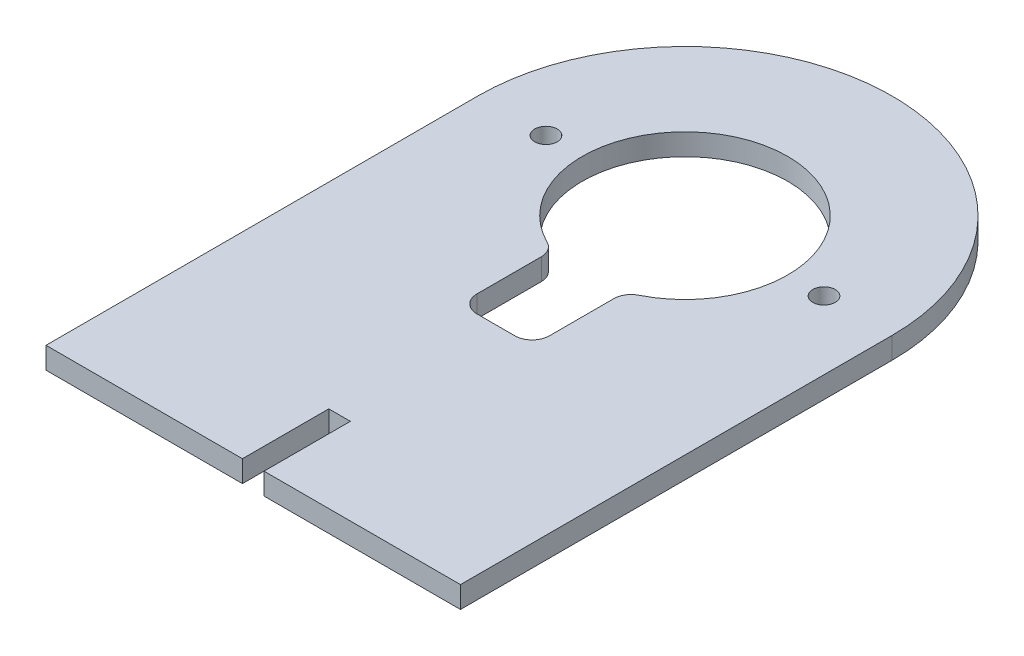
ISO-10303-21;
HEADER;
FILE_DESCRIPTION(('STEP AP214'),'2;1');
FILE_NAME('part.step','',(''),(''),'','','');
FILE_SCHEMA(('AUTOMOTIVE_DESIGN { 1 0 10303 214 1 1 1 1 }'));
ENDSEC;
DATA;
#1=APPLICATION_CONTEXT('core data for automotive mechanical design processes');
#2=APPLICATION_PROTOCOL_DEFINITION('international standard','automotive_design',2000,#1);
#3=PRODUCT_CONTEXT('',#1,'mechanical');
#4=PRODUCT('Part','Part','',(#3));
#5=PRODUCT_RELATED_PRODUCT_CATEGORY('part','',(#4));
#6=PRODUCT_DEFINITION_FORMATION('','',#4);
#7=PRODUCT_DEFINITION_CONTEXT('part definition',#1,'design');
#8=PRODUCT_DEFINITION('design','',#6,#7);
#9=PRODUCT_DEFINITION_SHAPE('','',#8);
#10=(LENGTH_UNIT() NAMED_UNIT(*) SI_UNIT(.MILLI.,.METRE.));
#11=(NAMED_UNIT(*) PLANE_ANGLE_UNIT() SI_UNIT($,.RADIAN.));
#12=(NAMED_UNIT(*) SI_UNIT($,.STERADIAN.) SOLID_ANGLE_UNIT());
#13=UNCERTAINTY_MEASURE_WITH_UNIT(LENGTH_MEASURE(1.E-05),#10,'distance_accuracy_value','');
#14=(GEOMETRIC_REPRESENTATION_CONTEXT(3) GLOBAL_UNCERTAINTY_ASSIGNED_CONTEXT((#13)) GLOBAL_UNIT_ASSIGNED_CONTEXT((#10,
#11,#12)) REPRESENTATION_CONTEXT('',''));
#15=CARTESIAN_POINT('',(0.,0.,0.));
#16=DIRECTION('',(0.,0.,1.));
#17=DIRECTION('',(1.,0.,0.));
#18=AXIS2_PLACEMENT_3D('',#15,#16,#17);
#19=CARTESIAN_POINT('',(30.48,3.175,0.));
#20=DIRECTION('',(1.,0.,0.));
#21=DIRECTION('',(0.,0.,-1.));
#22=AXIS2_PLACEMENT_3D('',#19,#20,#21);
#23=PLANE('',#22);
#24=DIRECTION('',(0.,0.,1.));
#25=VECTOR('',#24,1.);
#26=CARTESIAN_POINT('',(30.48,0.,0.));
#27=LINE('',#26,#25);
#28=CARTESIAN_POINT('',(30.48,0.,0.));
#29=VERTEX_POINT('',#28);
#30=CARTESIAN_POINT('',(30.48,0.,63.5));
#31=VERTEX_POINT('',#30);
#32=EDGE_CURVE('E156',#29,#31,#27,.T.);
#33=ORIENTED_EDGE('',*,*,#32,.F.);
#34=DIRECTION('',(0.,-1.,0.));
#35=VECTOR('',#34,1.);
#36=CARTESIAN_POINT('',(30.48,3.175,0.));
#37=LINE('',#36,#35);
#38=CARTESIAN_POINT('',(30.48,3.175,0.));
#39=VERTEX_POINT('',#38);
#40=EDGE_CURVE('E151',#39,#29,#37,.T.);
#41=ORIENTED_EDGE('',*,*,#40,.F.);
#42=DIRECTION('',(0.,0.,1.));
#43=VECTOR('',#42,1.);
#44=CARTESIAN_POINT('',(30.48,3.175,0.));
#45=LINE('',#44,#43);
#46=CARTESIAN_POINT('',(30.48,3.175,63.5));
#47=VERTEX_POINT('',#46);
#48=EDGE_CURVE('E154',#39,#47,#45,.T.);
#49=ORIENTED_EDGE('',*,*,#48,.T.);
#50=DIRECTION('',(0.,-1.,0.));
#51=VECTOR('',#50,1.);
#52=CARTESIAN_POINT('',(30.48,3.175,63.5));
#53=LINE('',#52,#51);
#54=EDGE_CURVE('E230',#47,#31,#53,.T.);
#55=ORIENTED_EDGE('',*,*,#54,.T.);
#56=EDGE_LOOP('',(#33,#41,#49,#55));
#57=FACE_BOUND('',#56,.T.);
#58=ADVANCED_FACE('F38',(#57),#23,.T.);
#59=CARTESIAN_POINT('',(0.,3.175,0.));
#60=DIRECTION('',(0.,-1.,0.));
#61=DIRECTION('',(0.,0.,-1.));
#62=AXIS2_PLACEMENT_3D('',#59,#60,#61);
#63=CYLINDRICAL_SURFACE('',#62,30.48);
#64=CARTESIAN_POINT('',(0.,0.,0.));
#65=DIRECTION('',(0.,1.,0.));
#66=DIRECTION('',(0.,0.,1.));
#67=AXIS2_PLACEMENT_3D('',#64,#65,#66);
#68=CIRCLE('',#67,30.48);
#69=CARTESIAN_POINT('',(-30.48,0.,0.));
#70=VERTEX_POINT('',#69);
#71=EDGE_CURVE('E212',#29,#70,#68,.T.);
#72=ORIENTED_EDGE('',*,*,#71,.T.);
#73=DIRECTION('',(0.,-1.,0.));
#74=VECTOR('',#73,1.);
#75=CARTESIAN_POINT('',(-30.48,3.175,0.));
#76=LINE('',#75,#74);
#77=CARTESIAN_POINT('',(-30.48,3.175,0.));
#78=VERTEX_POINT('',#77);
#79=EDGE_CURVE('E161',#78,#70,#76,.T.);
#80=ORIENTED_EDGE('',*,*,#79,.F.);
#81=CARTESIAN_POINT('',(0.,3.175,0.));
#82=DIRECTION('',(0.,1.,0.));
#83=DIRECTION('',(0.,0.,1.));
#84=AXIS2_PLACEMENT_3D('',#81,#82,#83);
#85=CIRCLE('',#84,30.48);
#86=EDGE_CURVE('E165',#39,#78,#85,.T.);
#87=ORIENTED_EDGE('',*,*,#86,.F.);
#88=ORIENTED_EDGE('',*,*,#40,.T.);
#89=EDGE_LOOP('',(#72,#80,#87,#88));
#90=FACE_BOUND('',#89,.T.);
#91=ADVANCED_FACE('F166',(#90),#63,.T.);
#92=CARTESIAN_POINT('',(-30.48,3.175,0.));
#93=DIRECTION('',(1.,0.,0.));
#94=DIRECTION('',(0.,0.,-1.));
#95=AXIS2_PLACEMENT_3D('',#92,#93,#94);
#96=PLANE('',#95);
#97=DIRECTION('',(0.,0.,1.));
#98=VECTOR('',#97,1.);
#99=CARTESIAN_POINT('',(-30.48,0.,0.));
#100=LINE('',#99,#98);
#101=CARTESIAN_POINT('',(-30.48,0.,63.5));
#102=VERTEX_POINT('',#101);
#103=EDGE_CURVE('E214',#70,#102,#100,.T.);
#104=ORIENTED_EDGE('',*,*,#103,.T.);
#105=DIRECTION('',(0.,-1.,0.));
#106=VECTOR('',#105,1.);
#107=CARTESIAN_POINT('',(-30.48,3.175,63.5));
#108=LINE('',#107,#106);
#109=CARTESIAN_POINT('',(-30.48,3.175,63.5));
#110=VERTEX_POINT('',#109);
#111=EDGE_CURVE('E242',#110,#102,#108,.T.);
#112=ORIENTED_EDGE('',*,*,#111,.F.);
#113=DIRECTION('',(0.,0.,1.));
#114=VECTOR('',#113,1.);
#115=CARTESIAN_POINT('',(-30.48,3.175,0.));
#116=LINE('',#115,#114);
#117=EDGE_CURVE('E170',#78,#110,#116,.T.);
#118=ORIENTED_EDGE('',*,*,#117,.F.);
#119=ORIENTED_EDGE('',*,*,#79,.T.);
#120=EDGE_LOOP('',(#104,#112,#118,#119));
#121=FACE_BOUND('',#120,.T.);
#122=ADVANCED_FACE('F311',(#121),#96,.F.);
#123=CARTESIAN_POINT('',(0.,3.175,63.5));
#124=DIRECTION('',(0.,0.,-1.));
#125=DIRECTION('',(-1.,0.,0.));
#126=AXIS2_PLACEMENT_3D('',#123,#124,#125);
#127=PLANE('',#126);
#128=DIRECTION('',(1.,0.,0.));
#129=VECTOR('',#128,1.);
#130=CARTESIAN_POINT('',(0.,0.,63.5));
#131=LINE('',#130,#129);
#132=CARTESIAN_POINT('',(-1.5875,0.,63.5));
#133=VERTEX_POINT('',#132);
#134=EDGE_CURVE('E217',#102,#133,#131,.T.);
#135=ORIENTED_EDGE('',*,*,#134,.T.);
#136=DIRECTION('',(0.,-1.,0.));
#137=VECTOR('',#136,1.);
#138=CARTESIAN_POINT('',(-1.5875,3.175,63.5));
#139=LINE('',#138,#137);
#140=CARTESIAN_POINT('',(-1.5875,3.175,63.5));
#141=VERTEX_POINT('',#140);
#142=EDGE_CURVE('E240',#141,#133,#139,.T.);
#143=ORIENTED_EDGE('',*,*,#142,.F.);
#144=DIRECTION('',(1.,0.,0.));
#145=VECTOR('',#144,1.);
#146=CARTESIAN_POINT('',(0.,3.175,63.5));
#147=LINE('',#146,#145);
#148=EDGE_CURVE('E184',#110,#141,#147,.T.);
#149=ORIENTED_EDGE('',*,*,#148,.F.);
#150=ORIENTED_EDGE('',*,*,#111,.T.);
#151=EDGE_LOOP('',(#135,#143,#149,#150));
#152=FACE_BOUND('',#151,.T.);
#153=ADVANCED_FACE('F315',(#152),#127,.F.);
#154=CARTESIAN_POINT('',(-1.5875,3.175,0.));
#155=DIRECTION('',(1.,0.,0.));
#156=DIRECTION('',(0.,0.,-1.));
#157=AXIS2_PLACEMENT_3D('',#154,#155,#156);
#158=PLANE('',#157);
#159=DIRECTION('',(0.,0.,1.));
#160=VECTOR('',#159,1.);
#161=CARTESIAN_POINT('',(-1.5875,0.,0.));
#162=LINE('',#161,#160);
#163=CARTESIAN_POINT('',(-1.5875,0.,50.8));
#164=VERTEX_POINT('',#163);
#165=EDGE_CURVE('E220',#164,#133,#162,.T.);
#166=ORIENTED_EDGE('',*,*,#165,.F.);
#167=DIRECTION('',(0.,-1.,0.));
#168=VECTOR('',#167,1.);
#169=CARTESIAN_POINT('',(-1.5875,3.175,50.8));
#170=LINE('',#169,#168);
#171=CARTESIAN_POINT('',(-1.5875,3.175,50.8));
#172=VERTEX_POINT('',#171);
#173=EDGE_CURVE('E238',#172,#164,#170,.T.);
#174=ORIENTED_EDGE('',*,*,#173,.F.);
#175=DIRECTION('',(0.,0.,1.));
#176=VECTOR('',#175,1.);
#177=CARTESIAN_POINT('',(-1.5875,3.175,0.));
#178=LINE('',#177,#176);
#179=EDGE_CURVE('E186',#172,#141,#178,.T.);
#180=ORIENTED_EDGE('',*,*,#179,.T.);
#181=ORIENTED_EDGE('',*,*,#142,.T.);
#182=EDGE_LOOP('',(#166,#174,#180,#181));
#183=FACE_BOUND('',#182,.T.);
#184=ADVANCED_FACE('F318',(#183),#158,.T.);
#185=CARTESIAN_POINT('',(0.,3.175,50.8));
#186=DIRECTION('',(0.,0.,-1.));
#187=DIRECTION('',(-1.,0.,0.));
#188=AXIS2_PLACEMENT_3D('',#185,#186,#187);
#189=PLANE('',#188);
#190=DIRECTION('',(1.,0.,0.));
#191=VECTOR('',#190,1.);
#192=CARTESIAN_POINT('',(0.,0.,50.8));
#193=LINE('',#192,#191);
#194=CARTESIAN_POINT('',(1.5875,0.,50.8));
#195=VERTEX_POINT('',#194);
#196=EDGE_CURVE('E224',#164,#195,#193,.T.);
#197=ORIENTED_EDGE('',*,*,#196,.T.);
#198=DIRECTION('',(0.,-1.,0.));
#199=VECTOR('',#198,1.);
#200=CARTESIAN_POINT('',(1.5875,3.175,50.8));
#201=LINE('',#200,#199);
#202=CARTESIAN_POINT('',(1.5875,3.175,50.8));
#203=VERTEX_POINT('',#202);
#204=EDGE_CURVE('E235',#203,#195,#201,.T.);
#205=ORIENTED_EDGE('',*,*,#204,.F.);
#206=DIRECTION('',(1.,0.,0.));
#207=VECTOR('',#206,1.);
#208=CARTESIAN_POINT('',(0.,3.175,50.8));
#209=LINE('',#208,#207);
#210=EDGE_CURVE('E189',#172,#203,#209,.T.);
#211=ORIENTED_EDGE('',*,*,#210,.F.);
#212=ORIENTED_EDGE('',*,*,#173,.T.);
#213=EDGE_LOOP('',(#197,#205,#211,#212));
#214=FACE_BOUND('',#213,.T.);
#215=ADVANCED_FACE('F323',(#214),#189,.F.);
#216=CARTESIAN_POINT('',(1.5875,3.175,0.));
#217=DIRECTION('',(1.,0.,0.));
#218=DIRECTION('',(0.,0.,-1.));
#219=AXIS2_PLACEMENT_3D('',#216,#217,#218);
#220=PLANE('',#219);
#221=DIRECTION('',(0.,0.,1.));
#222=VECTOR('',#221,1.);
#223=CARTESIAN_POINT('',(1.5875,0.,0.));
#224=LINE('',#223,#222);
#225=CARTESIAN_POINT('',(1.5875,0.,63.5));
#226=VERTEX_POINT('',#225);
#227=EDGE_CURVE('E227',#195,#226,#224,.T.);
#228=ORIENTED_EDGE('',*,*,#227,.T.);
#229=DIRECTION('',(0.,-1.,0.));
#230=VECTOR('',#229,1.);
#231=CARTESIAN_POINT('',(1.5875,3.175,63.5));
#232=LINE('',#231,#230);
#233=CARTESIAN_POINT('',(1.5875,3.175,63.5));
#234=VERTEX_POINT('',#233);
#235=EDGE_CURVE('E232',#234,#226,#232,.T.);
#236=ORIENTED_EDGE('',*,*,#235,.F.);
#237=DIRECTION('',(0.,0.,1.));
#238=VECTOR('',#237,1.);
#239=CARTESIAN_POINT('',(1.5875,3.175,0.));
#240=LINE('',#239,#238);
#241=EDGE_CURVE('E192',#203,#234,#240,.T.);
#242=ORIENTED_EDGE('',*,*,#241,.F.);
#243=ORIENTED_EDGE('',*,*,#204,.T.);
#244=EDGE_LOOP('',(#228,#236,#242,#243));
#245=FACE_BOUND('',#244,.T.);
#246=ADVANCED_FACE('F325',(#245),#220,.F.);
#247=CARTESIAN_POINT('',(0.,3.175,0.));
#248=DIRECTION('',(0.,-1.,0.));
#249=DIRECTION('',(0.,0.,-1.));
#250=AXIS2_PLACEMENT_3D('',#247,#248,#249);
#251=CYLINDRICAL_SURFACE('',#250,15.113);
#252=CARTESIAN_POINT('',(0.,0.,0.));
#253=DIRECTION('',(0.,1.,0.));
#254=DIRECTION('',(0.,0.,1.));
#255=AXIS2_PLACEMENT_3D('',#252,#253,#254);
#256=CIRCLE('',#255,15.113);
#257=CARTESIAN_POINT('',(6.74105035971223,0.,13.5263080346347));
#258=VERTEX_POINT('',#257);
#259=CARTESIAN_POINT('',(-6.74105035971223,0.,13.5263080346347));
#260=VERTEX_POINT('',#259);
#261=EDGE_CURVE('E194',#258,#260,#256,.T.);
#262=ORIENTED_EDGE('',*,*,#261,.F.);
#263=DIRECTION('',(0.,-1.,0.));
#264=VECTOR('',#263,1.);
#265=CARTESIAN_POINT('',(6.74105035971223,3.175,13.5263080346347));
#266=LINE('',#265,#264);
#267=CARTESIAN_POINT('',(6.74105035971223,3.175,13.5263080346347));
#268=VERTEX_POINT('',#267);
#269=EDGE_CURVE('E262',#258,#268,#266,.F.);
#270=ORIENTED_EDGE('',*,*,#269,.T.);
#271=CARTESIAN_POINT('',(0.,3.175,0.));
#272=DIRECTION('',(0.,1.,0.));
#273=DIRECTION('',(0.,0.,1.));
#274=AXIS2_PLACEMENT_3D('',#271,#272,#273);
#275=CIRCLE('',#274,15.113);
#276=CARTESIAN_POINT('',(-6.74105035971223,3.175,13.5263080346347));
#277=VERTEX_POINT('',#276);
#278=EDGE_CURVE('E299',#268,#277,#275,.T.);
#279=ORIENTED_EDGE('',*,*,#278,.T.);
#280=DIRECTION('',(0.,-1.,0.));
#281=VECTOR('',#280,1.);
#282=CARTESIAN_POINT('',(-6.74105035971223,3.175,13.5263080346347));
#283=LINE('',#282,#281);
#284=EDGE_CURVE('E259',#277,#260,#283,.T.);
#285=ORIENTED_EDGE('',*,*,#284,.T.);
#286=EDGE_LOOP('',(#262,#270,#279,#285));
#287=FACE_BOUND('',#286,.T.);
#288=ADVANCED_FACE('F327',(#287),#251,.F.);
#289=CARTESIAN_POINT('',(5.33399999999999,3.175,0.));
#290=DIRECTION('',(-1.,0.,0.));
#291=DIRECTION('',(0.,0.,1.));
#292=AXIS2_PLACEMENT_3D('',#289,#290,#291);
#293=PLANE('',#292);
#294=DIRECTION('',(0.,0.,-1.));
#295=VECTOR('',#294,1.);
#296=CARTESIAN_POINT('',(5.33399999999999,0.,0.));
#297=LINE('',#296,#295);
#298=CARTESIAN_POINT('',(5.334,0.,25.273));
#299=VERTEX_POINT('',#298);
#300=CARTESIAN_POINT('',(5.334,0.,15.7996371160859));
#301=VERTEX_POINT('',#300);
#302=EDGE_CURVE('E197',#299,#301,#297,.T.);
#303=ORIENTED_EDGE('',*,*,#302,.F.);
#304=DIRECTION('',(0.,-1.,0.));
#305=VECTOR('',#304,1.);
#306=CARTESIAN_POINT('',(5.334,3.175,25.273));
#307=LINE('',#306,#305);
#308=CARTESIAN_POINT('',(5.334,3.175,25.273));
#309=VERTEX_POINT('',#308);
#310=EDGE_CURVE('E253',#299,#309,#307,.F.);
#311=ORIENTED_EDGE('',*,*,#310,.T.);
#312=DIRECTION('',(0.,0.,-1.));
#313=VECTOR('',#312,1.);
#314=CARTESIAN_POINT('',(5.33399999999999,3.175,0.));
#315=LINE('',#314,#313);
#316=CARTESIAN_POINT('',(5.334,3.175,15.7996371160859));
#317=VERTEX_POINT('',#316);
#318=EDGE_CURVE('E294',#309,#317,#315,.T.);
#319=ORIENTED_EDGE('',*,*,#318,.T.);
#320=DIRECTION('',(0.,-1.,0.));
#321=VECTOR('',#320,1.);
#322=CARTESIAN_POINT('',(5.334,3.175,15.7996371160859));
#323=LINE('',#322,#321);
#324=EDGE_CURVE('E250',#317,#301,#323,.T.);
#325=ORIENTED_EDGE('',*,*,#324,.T.);
#326=EDGE_LOOP('',(#303,#311,#319,#325));
#327=FACE_BOUND('',#326,.T.);
#328=ADVANCED_FACE('F333',(#327),#293,.T.);
#329=CARTESIAN_POINT('',(0.,3.175,27.813));
#330=DIRECTION('',(0.,0.,-1.));
#331=DIRECTION('',(-1.,0.,0.));
#332=AXIS2_PLACEMENT_3D('',#329,#330,#331);
#333=PLANE('',#332);
#334=DIRECTION('',(1.,0.,0.));
#335=VECTOR('',#334,1.);
#336=CARTESIAN_POINT('',(0.,3.175,27.813));
#337=LINE('',#336,#335);
#338=CARTESIAN_POINT('',(-2.794,3.175,27.813));
#339=VERTEX_POINT('',#338);
#340=CARTESIAN_POINT('',(2.794,3.175,27.813));
#341=VERTEX_POINT('',#340);
#342=EDGE_CURVE('E291',#339,#341,#337,.T.);
#343=ORIENTED_EDGE('',*,*,#342,.T.);
#344=DIRECTION('',(0.,-1.,0.));
#345=VECTOR('',#344,1.);
#346=CARTESIAN_POINT('',(2.794,0.,27.813));
#347=LINE('',#346,#345);
#348=CARTESIAN_POINT('',(2.794,0.,27.813));
#349=VERTEX_POINT('',#348);
#350=EDGE_CURVE('E247',#341,#349,#347,.T.);
#351=ORIENTED_EDGE('',*,*,#350,.T.);
#352=DIRECTION('',(1.,0.,0.));
#353=VECTOR('',#352,1.);
#354=CARTESIAN_POINT('',(0.,0.,27.813));
#355=LINE('',#354,#353);
#356=CARTESIAN_POINT('',(-2.794,0.,27.813));
#357=VERTEX_POINT('',#356);
#358=EDGE_CURVE('E200',#357,#349,#355,.T.);
#359=ORIENTED_EDGE('',*,*,#358,.F.);
#360=DIRECTION('',(0.,-1.,0.));
#361=VECTOR('',#360,1.);
#362=CARTESIAN_POINT('',(-2.794,3.175,27.813));
#363=LINE('',#362,#361);
#364=EDGE_CURVE('E160',#357,#339,#363,.F.);
#365=ORIENTED_EDGE('',*,*,#364,.T.);
#366=EDGE_LOOP('',(#343,#351,#359,#365));
#367=FACE_BOUND('',#366,.T.);
#368=ADVANCED_FACE('F285',(#367),#333,.T.);
#369=CARTESIAN_POINT('',(-20.447,3.175,0.));
#370=DIRECTION('',(0.,-1.,0.));
#371=DIRECTION('',(0.,0.,-1.));
#372=AXIS2_PLACEMENT_3D('',#369,#370,#371);
#373=CYLINDRICAL_SURFACE('',#372,1.651);
#374=CARTESIAN_POINT('',(-20.447,3.175,0.));
#375=DIRECTION('',(0.,1.,0.));
#376=DIRECTION('',(0.,0.,1.));
#377=AXIS2_PLACEMENT_3D('',#374,#375,#376);
#378=CIRCLE('',#377,1.651);
#379=CARTESIAN_POINT('',(-20.447,3.175,1.651));
#380=VERTEX_POINT('',#379);
#381=EDGE_CURVE('E176',#380,#380,#378,.T.);
#382=ORIENTED_EDGE('',*,*,#381,.T.);
#383=EDGE_LOOP('',(#382));
#384=FACE_BOUND('',#383,.T.);
#385=CARTESIAN_POINT('',(-20.447,0.,0.));
#386=DIRECTION('',(0.,1.,0.));
#387=DIRECTION('',(0.,0.,1.));
#388=AXIS2_PLACEMENT_3D('',#385,#386,#387);
#389=CIRCLE('',#388,1.651);
#390=CARTESIAN_POINT('',(-20.447,0.,1.651));
#391=VERTEX_POINT('',#390);
#392=EDGE_CURVE('E208',#391,#391,#389,.T.);
#393=ORIENTED_EDGE('',*,*,#392,.F.);
#394=EDGE_LOOP('',(#393));
#395=FACE_BOUND('',#394,.T.);
#396=ADVANCED_FACE('F345',(#384,#395),#373,.F.);
#397=CARTESIAN_POINT('',(20.447,3.175,0.));
#398=DIRECTION('',(0.,-1.,0.));
#399=DIRECTION('',(0.,0.,-1.));
#400=AXIS2_PLACEMENT_3D('',#397,#398,#399);
#401=CYLINDRICAL_SURFACE('',#400,1.651);
#402=CARTESIAN_POINT('',(20.447,3.175,0.));
#403=DIRECTION('',(0.,1.,0.));
#404=DIRECTION('',(0.,0.,1.));
#405=AXIS2_PLACEMENT_3D('',#402,#403,#404);
#406=CIRCLE('',#405,1.651);
#407=CARTESIAN_POINT('',(20.447,3.175,1.65099999999999));
#408=VERTEX_POINT('',#407);
#409=EDGE_CURVE('E179',#408,#408,#406,.T.);
#410=ORIENTED_EDGE('',*,*,#409,.T.);
#411=EDGE_LOOP('',(#410));
#412=FACE_BOUND('',#411,.T.);
#413=CARTESIAN_POINT('',(20.447,0.,0.));
#414=DIRECTION('',(0.,1.,0.));
#415=DIRECTION('',(0.,0.,1.));
#416=AXIS2_PLACEMENT_3D('',#413,#414,#415);
#417=CIRCLE('',#416,1.651);
#418=CARTESIAN_POINT('',(20.447,0.,1.65099999999999));
#419=VERTEX_POINT('',#418);
#420=EDGE_CURVE('E205',#419,#419,#417,.T.);
#421=ORIENTED_EDGE('',*,*,#420,.F.);
#422=EDGE_LOOP('',(#421));
#423=FACE_BOUND('',#422,.T.);
#424=ADVANCED_FACE('F348',(#412,#423),#401,.F.);
#425=CARTESIAN_POINT('',(-5.334,3.175,0.));
#426=DIRECTION('',(-1.,0.,0.));
#427=DIRECTION('',(0.,0.,1.));
#428=AXIS2_PLACEMENT_3D('',#425,#426,#427);
#429=PLANE('',#428);
#430=DIRECTION('',(0.,0.,-1.));
#431=VECTOR('',#430,1.);
#432=CARTESIAN_POINT('',(-5.334,3.175,0.));
#433=LINE('',#432,#431);
#434=CARTESIAN_POINT('',(-5.334,3.175,25.273));
#435=VERTEX_POINT('',#434);
#436=CARTESIAN_POINT('',(-5.334,3.175,15.7996371160859));
#437=VERTEX_POINT('',#436);
#438=EDGE_CURVE('E289',#435,#437,#433,.T.);
#439=ORIENTED_EDGE('',*,*,#438,.F.);
#440=DIRECTION('',(0.,-1.,0.));
#441=VECTOR('',#440,1.);
#442=CARTESIAN_POINT('',(-5.334,3.175,25.273));
#443=LINE('',#442,#441);
#444=CARTESIAN_POINT('',(-5.334,0.,25.273));
#445=VERTEX_POINT('',#444);
#446=EDGE_CURVE('E269',#435,#445,#443,.T.);
#447=ORIENTED_EDGE('',*,*,#446,.T.);
#448=DIRECTION('',(0.,0.,-1.));
#449=VECTOR('',#448,1.);
#450=CARTESIAN_POINT('',(-5.334,0.,0.));
#451=LINE('',#450,#449);
#452=CARTESIAN_POINT('',(-5.334,0.,15.7996371160859));
#453=VERTEX_POINT('',#452);
#454=EDGE_CURVE('E203',#445,#453,#451,.T.);
#455=ORIENTED_EDGE('',*,*,#454,.T.);
#456=DIRECTION('',(0.,1.,0.));
#457=VECTOR('',#456,1.);
#458=CARTESIAN_POINT('',(-5.334,3.175,15.7996371160859));
#459=LINE('',#458,#457);
#460=EDGE_CURVE('E53',#453,#437,#459,.T.);
#461=ORIENTED_EDGE('',*,*,#460,.T.);
#462=EDGE_LOOP('',(#439,#447,#455,#461));
#463=FACE_BOUND('',#462,.T.);
#464=ADVANCED_FACE('F288',(#463),#429,.F.);
#465=EDGE_CURVE('E221',#226,#31,#131,.T.);
#466=ORIENTED_EDGE('',*,*,#465,.T.);
#467=ORIENTED_EDGE('',*,*,#54,.F.);
#468=EDGE_CURVE('E174',#234,#47,#147,.T.);
#469=ORIENTED_EDGE('',*,*,#468,.F.);
#470=ORIENTED_EDGE('',*,*,#235,.T.);
#471=EDGE_LOOP('',(#466,#467,#469,#470));
#472=FACE_BOUND('',#471,.T.);
#473=ADVANCED_FACE('F306',(#472),#127,.F.);
#474=CARTESIAN_POINT('',(0.,3.175,0.));
#475=DIRECTION('',(0.,1.,0.));
#476=DIRECTION('',(0.,0.,1.));
#477=AXIS2_PLACEMENT_3D('',#474,#475,#476);
#478=PLANE('',#477);
#479=ORIENTED_EDGE('',*,*,#278,.F.);
#480=CARTESIAN_POINT('',(7.874,3.175,15.7996371160859));
#481=DIRECTION('',(0.,1.,0.));
#482=DIRECTION('',(0.,0.,1.));
#483=AXIS2_PLACEMENT_3D('',#480,#481,#482);
#484=CIRCLE('',#483,2.54);
#485=EDGE_CURVE('E266',#268,#317,#484,.T.);
#486=ORIENTED_EDGE('',*,*,#485,.T.);
#487=ORIENTED_EDGE('',*,*,#318,.F.);
#488=CARTESIAN_POINT('',(2.794,3.175,25.273));
#489=DIRECTION('',(0.,1.,0.));
#490=DIRECTION('',(0.,0.,1.));
#491=AXIS2_PLACEMENT_3D('',#488,#489,#490);
#492=CIRCLE('',#491,2.54);
#493=EDGE_CURVE('E274',#309,#341,#492,.F.);
#494=ORIENTED_EDGE('',*,*,#493,.T.);
#495=ORIENTED_EDGE('',*,*,#342,.F.);
#496=CARTESIAN_POINT('',(-2.794,3.175,25.273));
#497=DIRECTION('',(0.,1.,0.));
#498=DIRECTION('',(0.,0.,1.));
#499=AXIS2_PLACEMENT_3D('',#496,#497,#498);
#500=CIRCLE('',#499,2.54);
#501=EDGE_CURVE('E11',#339,#435,#500,.F.);
#502=ORIENTED_EDGE('',*,*,#501,.T.);
#503=ORIENTED_EDGE('',*,*,#438,.T.);
#504=CARTESIAN_POINT('',(-7.874,3.175,15.7996371160859));
#505=DIRECTION('',(0.,1.,0.));
#506=DIRECTION('',(0.,0.,1.));
#507=AXIS2_PLACEMENT_3D('',#504,#505,#506);
#508=CIRCLE('',#507,2.54);
#509=EDGE_CURVE('E264',#437,#277,#508,.T.);
#510=ORIENTED_EDGE('',*,*,#509,.T.);
#511=EDGE_LOOP('',(#479,#486,#487,#494,#495,#502,#503,#510));
#512=FACE_BOUND('',#511,.T.);
#513=ORIENTED_EDGE('',*,*,#409,.F.);
#514=EDGE_LOOP('',(#513));
#515=FACE_BOUND('',#514,.T.);
#516=ORIENTED_EDGE('',*,*,#381,.F.);
#517=EDGE_LOOP('',(#516));
#518=FACE_BOUND('',#517,.T.);
#519=ORIENTED_EDGE('',*,*,#48,.F.);
#520=ORIENTED_EDGE('',*,*,#86,.T.);
#521=ORIENTED_EDGE('',*,*,#117,.T.);
#522=ORIENTED_EDGE('',*,*,#148,.T.);
#523=ORIENTED_EDGE('',*,*,#179,.F.);
#524=ORIENTED_EDGE('',*,*,#210,.T.);
#525=ORIENTED_EDGE('',*,*,#241,.T.);
#526=ORIENTED_EDGE('',*,*,#468,.T.);
#527=EDGE_LOOP('',(#519,#520,#521,#522,#523,#524,#525,#526));
#528=FACE_BOUND('',#527,.T.);
#529=ADVANCED_FACE('F172',(#512,#515,#518,#528),#478,.T.);
#530=CARTESIAN_POINT('',(0.,0.,0.));
#531=DIRECTION('',(0.,1.,0.));
#532=DIRECTION('',(0.,0.,1.));
#533=AXIS2_PLACEMENT_3D('',#530,#531,#532);
#534=PLANE('',#533);
#535=ORIENTED_EDGE('',*,*,#302,.T.);
#536=CARTESIAN_POINT('',(7.874,0.,15.7996371160859));
#537=DIRECTION('',(0.,1.,0.));
#538=DIRECTION('',(0.,0.,1.));
#539=AXIS2_PLACEMENT_3D('',#536,#537,#538);
#540=CIRCLE('',#539,2.54);
#541=EDGE_CURVE('E257',#301,#258,#540,.F.);
#542=ORIENTED_EDGE('',*,*,#541,.T.);
#543=ORIENTED_EDGE('',*,*,#261,.T.);
#544=CARTESIAN_POINT('',(-7.874,0.,15.7996371160859));
#545=DIRECTION('',(0.,1.,0.));
#546=DIRECTION('',(0.,0.,1.));
#547=AXIS2_PLACEMENT_3D('',#544,#545,#546);
#548=CIRCLE('',#547,2.54);
#549=EDGE_CURVE('E255',#260,#453,#548,.F.);
#550=ORIENTED_EDGE('',*,*,#549,.T.);
#551=ORIENTED_EDGE('',*,*,#454,.F.);
#552=CARTESIAN_POINT('',(-2.794,0.,25.273));
#553=DIRECTION('',(0.,1.,0.));
#554=DIRECTION('',(0.,0.,1.));
#555=AXIS2_PLACEMENT_3D('',#552,#553,#554);
#556=CIRCLE('',#555,2.54);
#557=EDGE_CURVE('E46',#445,#357,#556,.T.);
#558=ORIENTED_EDGE('',*,*,#557,.T.);
#559=ORIENTED_EDGE('',*,*,#358,.T.);
#560=CARTESIAN_POINT('',(2.794,0.,25.273));
#561=DIRECTION('',(0.,1.,0.));
#562=DIRECTION('',(0.,0.,1.));
#563=AXIS2_PLACEMENT_3D('',#560,#561,#562);
#564=CIRCLE('',#563,2.54);
#565=EDGE_CURVE('E272',#349,#299,#564,.T.);
#566=ORIENTED_EDGE('',*,*,#565,.T.);
#567=EDGE_LOOP('',(#535,#542,#543,#550,#551,#558,#559,#566));
#568=FACE_BOUND('',#567,.T.);
#569=ORIENTED_EDGE('',*,*,#420,.T.);
#570=EDGE_LOOP('',(#569));
#571=FACE_BOUND('',#570,.T.);
#572=ORIENTED_EDGE('',*,*,#392,.T.);
#573=EDGE_LOOP('',(#572));
#574=FACE_BOUND('',#573,.T.);
#575=ORIENTED_EDGE('',*,*,#32,.T.);
#576=ORIENTED_EDGE('',*,*,#465,.F.);
#577=ORIENTED_EDGE('',*,*,#227,.F.);
#578=ORIENTED_EDGE('',*,*,#196,.F.);
#579=ORIENTED_EDGE('',*,*,#165,.T.);
#580=ORIENTED_EDGE('',*,*,#134,.F.);
#581=ORIENTED_EDGE('',*,*,#103,.F.);
#582=ORIENTED_EDGE('',*,*,#71,.F.);
#583=EDGE_LOOP('',(#575,#576,#577,#578,#579,#580,#581,#582));
#584=FACE_BOUND('',#583,.T.);
#585=ADVANCED_FACE('F278',(#568,#571,#574,#584),#534,.F.);
#586=CARTESIAN_POINT('',(2.794,3.175,25.273));
#587=DIRECTION('',(0.,1.,0.));
#588=DIRECTION('',(0.,0.,1.));
#589=AXIS2_PLACEMENT_3D('',#586,#587,#588);
#590=CYLINDRICAL_SURFACE('',#589,2.54);
#591=ORIENTED_EDGE('',*,*,#493,.F.);
#592=ORIENTED_EDGE('',*,*,#310,.F.);
#593=ORIENTED_EDGE('',*,*,#565,.F.);
#594=ORIENTED_EDGE('',*,*,#350,.F.);
#595=EDGE_LOOP('',(#591,#592,#593,#594));
#596=FACE_BOUND('',#595,.T.);
#597=ADVANCED_FACE('F360',(#596),#590,.F.);
#598=CARTESIAN_POINT('',(7.874,3.175,15.7996371160859));
#599=DIRECTION('',(0.,-1.,0.));
#600=DIRECTION('',(0.,0.,-1.));
#601=AXIS2_PLACEMENT_3D('',#598,#599,#600);
#602=CYLINDRICAL_SURFACE('',#601,2.54);
#603=ORIENTED_EDGE('',*,*,#485,.F.);
#604=ORIENTED_EDGE('',*,*,#269,.F.);
#605=ORIENTED_EDGE('',*,*,#541,.F.);
#606=ORIENTED_EDGE('',*,*,#324,.F.);
#607=EDGE_LOOP('',(#603,#604,#605,#606));
#608=FACE_BOUND('',#607,.T.);
#609=ADVANCED_FACE('F363',(#608),#602,.T.);
#610=CARTESIAN_POINT('',(-2.794,3.175,25.273));
#611=DIRECTION('',(0.,-1.,0.));
#612=DIRECTION('',(0.,0.,-1.));
#613=AXIS2_PLACEMENT_3D('',#610,#611,#612);
#614=CYLINDRICAL_SURFACE('',#613,2.54);
#615=ORIENTED_EDGE('',*,*,#501,.F.);
#616=ORIENTED_EDGE('',*,*,#364,.F.);
#617=ORIENTED_EDGE('',*,*,#557,.F.);
#618=ORIENTED_EDGE('',*,*,#446,.F.);
#619=EDGE_LOOP('',(#615,#616,#617,#618));
#620=FACE_BOUND('',#619,.T.);
#621=ADVANCED_FACE('F287',(#620),#614,.F.);
#622=CARTESIAN_POINT('',(-7.874,3.175,15.7996371160859));
#623=DIRECTION('',(0.,-1.,0.));
#624=DIRECTION('',(0.,0.,-1.));
#625=AXIS2_PLACEMENT_3D('',#622,#623,#624);
#626=CYLINDRICAL_SURFACE('',#625,2.54);
#627=ORIENTED_EDGE('',*,*,#509,.F.);
#628=ORIENTED_EDGE('',*,*,#460,.F.);
#629=ORIENTED_EDGE('',*,*,#549,.F.);
#630=ORIENTED_EDGE('',*,*,#284,.F.);
#631=EDGE_LOOP('',(#627,#628,#629,#630));
#632=FACE_BOUND('',#631,.T.);
#633=ADVANCED_FACE('F40',(#632),#626,.T.);
#634=CLOSED_SHELL('',(#58,#91,#122,#153,#184,#215,#246,#288,#328,#368,#396,#424,#464,#473,#529,
#585,#597,#609,#621,#633));
#635=MANIFOLD_SOLID_BREP('B2',#634);
#636=ADVANCED_BREP_SHAPE_REPRESENTATION('',(#18,#635),#14);
#637=SHAPE_DEFINITION_REPRESENTATION(#9,#636);
ENDSEC;
END-ISO-10303-21;
